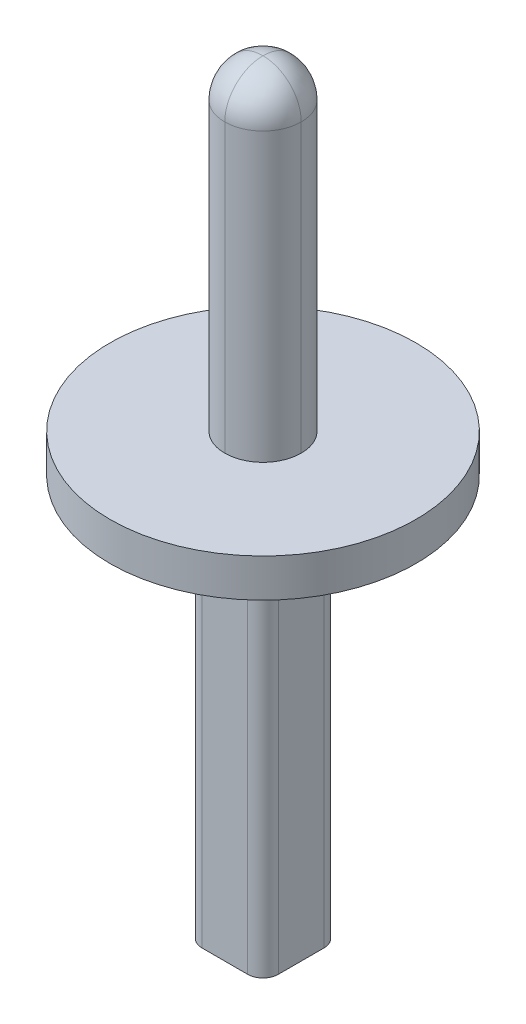
ISO-10303-21;
HEADER;
FILE_DESCRIPTION(('STEP AP214'),'2;1');
FILE_NAME('part.step','',(''),(''),'','','');
FILE_SCHEMA(('AUTOMOTIVE_DESIGN { 1 0 10303 214 1 1 1 1 }'));
ENDSEC;
DATA;
#1=APPLICATION_CONTEXT('core data for automotive mechanical design processes');
#2=APPLICATION_PROTOCOL_DEFINITION('international standard','automotive_design',2000,#1);
#3=PRODUCT_CONTEXT('',#1,'mechanical');
#4=PRODUCT('Part','Part','',(#3));
#5=PRODUCT_RELATED_PRODUCT_CATEGORY('part','',(#4));
#6=PRODUCT_DEFINITION_FORMATION('','',#4);
#7=PRODUCT_DEFINITION_CONTEXT('part definition',#1,'design');
#8=PRODUCT_DEFINITION('design','',#6,#7);
#9=PRODUCT_DEFINITION_SHAPE('','',#8);
#10=(LENGTH_UNIT() NAMED_UNIT(*) SI_UNIT(.MILLI.,.METRE.));
#11=(NAMED_UNIT(*) PLANE_ANGLE_UNIT() SI_UNIT($,.RADIAN.));
#12=(NAMED_UNIT(*) SI_UNIT($,.STERADIAN.) SOLID_ANGLE_UNIT());
#13=UNCERTAINTY_MEASURE_WITH_UNIT(LENGTH_MEASURE(1.E-05),#10,'distance_accuracy_value','');
#14=(GEOMETRIC_REPRESENTATION_CONTEXT(3) GLOBAL_UNCERTAINTY_ASSIGNED_CONTEXT((#13)) GLOBAL_UNIT_ASSIGNED_CONTEXT((#10,
#11,#12)) REPRESENTATION_CONTEXT('',''));
#15=CARTESIAN_POINT('',(0.,0.,0.));
#16=DIRECTION('',(0.,0.,1.));
#17=DIRECTION('',(1.,0.,0.));
#18=AXIS2_PLACEMENT_3D('',#15,#16,#17);
#19=CARTESIAN_POINT('',(0.,7.50000000000001,0.));
#20=DIRECTION('',(0.,1.,0.));
#21=DIRECTION('',(0.,0.,1.));
#22=AXIS2_PLACEMENT_3D('',#19,#20,#21);
#23=PLANE('',#22);
#24=CARTESIAN_POINT('',(0.,7.50000000000001,0.));
#25=DIRECTION('',(0.,1.,0.));
#26=DIRECTION('',(0.,0.,1.));
#27=AXIS2_PLACEMENT_3D('',#24,#25,#26);
#28=CIRCLE('',#27,5.);
#29=CARTESIAN_POINT('',(-5.,7.50000000000001,0.));
#30=VERTEX_POINT('',#29);
#31=CARTESIAN_POINT('',(0.,7.50000000000001,-5.));
#32=VERTEX_POINT('',#31);
#33=EDGE_CURVE('E178',#30,#32,#28,.F.);
#34=ORIENTED_EDGE('',*,*,#33,.T.);
#35=CARTESIAN_POINT('',(0.,7.50000000000001,0.));
#36=DIRECTION('',(0.,1.,0.));
#37=DIRECTION('',(0.,0.,1.));
#38=AXIS2_PLACEMENT_3D('',#35,#36,#37);
#39=CIRCLE('',#38,5.);
#40=CARTESIAN_POINT('',(5.,7.50000000000001,0.));
#41=VERTEX_POINT('',#40);
#42=EDGE_CURVE('E162',#32,#41,#39,.F.);
#43=ORIENTED_EDGE('',*,*,#42,.T.);
#44=CARTESIAN_POINT('',(0.,7.50000000000001,0.));
#45=DIRECTION('',(0.,1.,0.));
#46=DIRECTION('',(0.,0.,1.));
#47=AXIS2_PLACEMENT_3D('',#44,#45,#46);
#48=CIRCLE('',#47,5.);
#49=CARTESIAN_POINT('',(0.,7.50000000000001,5.));
#50=VERTEX_POINT('',#49);
#51=EDGE_CURVE('E174',#41,#50,#48,.F.);
#52=ORIENTED_EDGE('',*,*,#51,.T.);
#53=CARTESIAN_POINT('',(0.,7.50000000000001,0.));
#54=DIRECTION('',(0.,1.,0.));
#55=DIRECTION('',(0.,0.,1.));
#56=AXIS2_PLACEMENT_3D('',#53,#54,#55);
#57=CIRCLE('',#56,5.);
#58=EDGE_CURVE('E176',#50,#30,#57,.F.);
#59=ORIENTED_EDGE('',*,*,#58,.T.);
#60=EDGE_LOOP('',(#34,#43,#52,#59));
#61=FACE_BOUND('',#60,.T.);
#62=CARTESIAN_POINT('',(0.,7.50000000000001,0.));
#63=DIRECTION('',(0.,1.,0.));
#64=DIRECTION('',(0.,0.,1.));
#65=AXIS2_PLACEMENT_3D('',#62,#63,#64);
#66=CIRCLE('',#65,20.);
#67=CARTESIAN_POINT('',(0.,7.50000000000001,20.));
#68=VERTEX_POINT('',#67);
#69=EDGE_CURVE('E228',#68,#68,#66,.T.);
#70=ORIENTED_EDGE('',*,*,#69,.T.);
#71=EDGE_LOOP('',(#70));
#72=FACE_BOUND('',#71,.T.);
#73=ADVANCED_FACE('F41',(#61,#72),#23,.T.);
#74=CARTESIAN_POINT('',(0.,2.5,0.));
#75=DIRECTION('',(0.,1.,0.));
#76=DIRECTION('',(0.,0.,1.));
#77=AXIS2_PLACEMENT_3D('',#74,#75,#76);
#78=PLANE('',#77);
#79=CARTESIAN_POINT('',(0.,2.5,0.));
#80=DIRECTION('',(0.,1.,0.));
#81=DIRECTION('',(0.,0.,1.));
#82=AXIS2_PLACEMENT_3D('',#79,#80,#81);
#83=CIRCLE('',#82,20.);
#84=CARTESIAN_POINT('',(0.,2.5,20.));
#85=VERTEX_POINT('',#84);
#86=EDGE_CURVE('E229',#85,#85,#83,.T.);
#87=ORIENTED_EDGE('',*,*,#86,.F.);
#88=EDGE_LOOP('',(#87));
#89=FACE_BOUND('',#88,.T.);
#90=DIRECTION('',(-1.,0.,0.));
#91=VECTOR('',#90,1.);
#92=CARTESIAN_POINT('',(-5.,2.5,-5.));
#93=LINE('',#92,#91);
#94=CARTESIAN_POINT('',(3.,2.5,-5.));
#95=VERTEX_POINT('',#94);
#96=CARTESIAN_POINT('',(-3.,2.5,-5.));
#97=VERTEX_POINT('',#96);
#98=EDGE_CURVE('E232',#95,#97,#93,.T.);
#99=ORIENTED_EDGE('',*,*,#98,.T.);
#100=CARTESIAN_POINT('',(-3.,2.5,-3.));
#101=DIRECTION('',(0.,1.,0.));
#102=DIRECTION('',(0.,0.,1.));
#103=AXIS2_PLACEMENT_3D('',#100,#101,#102);
#104=CIRCLE('',#103,2.);
#105=CARTESIAN_POINT('',(-5.,2.5,-3.));
#106=VERTEX_POINT('',#105);
#107=EDGE_CURVE('E130',#97,#106,#104,.T.);
#108=ORIENTED_EDGE('',*,*,#107,.T.);
#109=DIRECTION('',(0.,0.,1.));
#110=VECTOR('',#109,1.);
#111=CARTESIAN_POINT('',(-5.,2.5,-5.));
#112=LINE('',#111,#110);
#113=CARTESIAN_POINT('',(-5.,2.5,3.));
#114=VERTEX_POINT('',#113);
#115=EDGE_CURVE('E165',#106,#114,#112,.T.);
#116=ORIENTED_EDGE('',*,*,#115,.T.);
#117=CARTESIAN_POINT('',(-3.,2.5,3.));
#118=DIRECTION('',(0.,1.,0.));
#119=DIRECTION('',(0.,0.,1.));
#120=AXIS2_PLACEMENT_3D('',#117,#118,#119);
#121=CIRCLE('',#120,2.);
#122=CARTESIAN_POINT('',(-3.,2.5,5.));
#123=VERTEX_POINT('',#122);
#124=EDGE_CURVE('E183',#114,#123,#121,.T.);
#125=ORIENTED_EDGE('',*,*,#124,.T.);
#126=DIRECTION('',(1.,0.,0.));
#127=VECTOR('',#126,1.);
#128=CARTESIAN_POINT('',(-5.,2.5,5.));
#129=LINE('',#128,#127);
#130=CARTESIAN_POINT('',(3.,2.5,5.));
#131=VERTEX_POINT('',#130);
#132=EDGE_CURVE('E239',#123,#131,#129,.T.);
#133=ORIENTED_EDGE('',*,*,#132,.T.);
#134=CARTESIAN_POINT('',(3.,2.5,3.));
#135=DIRECTION('',(0.,1.,0.));
#136=DIRECTION('',(0.,0.,1.));
#137=AXIS2_PLACEMENT_3D('',#134,#135,#136);
#138=CIRCLE('',#137,2.);
#139=CARTESIAN_POINT('',(5.,2.5,3.));
#140=VERTEX_POINT('',#139);
#141=EDGE_CURVE('E181',#131,#140,#138,.T.);
#142=ORIENTED_EDGE('',*,*,#141,.T.);
#143=DIRECTION('',(0.,0.,-1.));
#144=VECTOR('',#143,1.);
#145=CARTESIAN_POINT('',(5.,2.5,-5.));
#146=LINE('',#145,#144);
#147=CARTESIAN_POINT('',(5.,2.5,-3.));
#148=VERTEX_POINT('',#147);
#149=EDGE_CURVE('E236',#140,#148,#146,.T.);
#150=ORIENTED_EDGE('',*,*,#149,.T.);
#151=CARTESIAN_POINT('',(3.,2.5,-3.));
#152=DIRECTION('',(0.,1.,0.));
#153=DIRECTION('',(0.,0.,1.));
#154=AXIS2_PLACEMENT_3D('',#151,#152,#153);
#155=CIRCLE('',#154,2.);
#156=EDGE_CURVE('E185',#148,#95,#155,.T.);
#157=ORIENTED_EDGE('',*,*,#156,.T.);
#158=EDGE_LOOP('',(#99,#108,#116,#125,#133,#142,#150,#157));
#159=FACE_BOUND('',#158,.T.);
#160=ADVANCED_FACE('F243',(#89,#159),#78,.F.);
#161=CARTESIAN_POINT('',(0.,7.50000000000001,0.));
#162=DIRECTION('',(0.,-1.,0.));
#163=DIRECTION('',(0.,0.,-1.));
#164=AXIS2_PLACEMENT_3D('',#161,#162,#163);
#165=CYLINDRICAL_SURFACE('',#164,20.);
#166=ORIENTED_EDGE('',*,*,#69,.F.);
#167=EDGE_LOOP('',(#166));
#168=FACE_BOUND('',#167,.T.);
#169=ORIENTED_EDGE('',*,*,#86,.T.);
#170=EDGE_LOOP('',(#169));
#171=FACE_BOUND('',#170,.T.);
#172=ADVANCED_FACE('F295',(#168,#171),#165,.T.);
#173=CARTESIAN_POINT('',(0.,-50.,0.));
#174=DIRECTION('',(0.,-1.,0.));
#175=DIRECTION('',(0.,0.,-1.));
#176=AXIS2_PLACEMENT_3D('',#173,#174,#175);
#177=PLANE('',#176);
#178=DIRECTION('',(0.,0.,1.));
#179=VECTOR('',#178,1.);
#180=CARTESIAN_POINT('',(-5.,-50.,5.));
#181=LINE('',#180,#179);
#182=CARTESIAN_POINT('',(-5.,-50.,-3.));
#183=VERTEX_POINT('',#182);
#184=CARTESIAN_POINT('',(-5.,-50.,3.));
#185=VERTEX_POINT('',#184);
#186=EDGE_CURVE('E219',#183,#185,#181,.T.);
#187=ORIENTED_EDGE('',*,*,#186,.F.);
#188=CARTESIAN_POINT('',(-3.,-50.,-3.));
#189=DIRECTION('',(0.,-1.,0.));
#190=DIRECTION('',(0.,0.,-1.));
#191=AXIS2_PLACEMENT_3D('',#188,#189,#190);
#192=CIRCLE('',#191,2.);
#193=CARTESIAN_POINT('',(-3.,-50.,-5.));
#194=VERTEX_POINT('',#193);
#195=EDGE_CURVE('E203',#183,#194,#192,.T.);
#196=ORIENTED_EDGE('',*,*,#195,.T.);
#197=DIRECTION('',(-1.,0.,0.));
#198=VECTOR('',#197,1.);
#199=CARTESIAN_POINT('',(-5.,-50.,-5.));
#200=LINE('',#199,#198);
#201=CARTESIAN_POINT('',(3.,-50.,-5.));
#202=VERTEX_POINT('',#201);
#203=EDGE_CURVE('E222',#202,#194,#200,.T.);
#204=ORIENTED_EDGE('',*,*,#203,.F.);
#205=CARTESIAN_POINT('',(3.,-50.,-3.));
#206=DIRECTION('',(0.,-1.,0.));
#207=DIRECTION('',(0.,0.,-1.));
#208=AXIS2_PLACEMENT_3D('',#205,#206,#207);
#209=CIRCLE('',#208,2.);
#210=CARTESIAN_POINT('',(5.,-50.,-3.));
#211=VERTEX_POINT('',#210);
#212=EDGE_CURVE('E205',#202,#211,#209,.T.);
#213=ORIENTED_EDGE('',*,*,#212,.T.);
#214=DIRECTION('',(0.,0.,-1.));
#215=VECTOR('',#214,1.);
#216=CARTESIAN_POINT('',(5.,-50.,5.));
#217=LINE('',#216,#215);
#218=CARTESIAN_POINT('',(5.,-50.,3.));
#219=VERTEX_POINT('',#218);
#220=EDGE_CURVE('E225',#219,#211,#217,.T.);
#221=ORIENTED_EDGE('',*,*,#220,.F.);
#222=CARTESIAN_POINT('',(3.,-50.,3.));
#223=DIRECTION('',(0.,-1.,0.));
#224=DIRECTION('',(0.,0.,-1.));
#225=AXIS2_PLACEMENT_3D('',#222,#223,#224);
#226=CIRCLE('',#225,2.);
#227=CARTESIAN_POINT('',(3.,-50.,5.));
#228=VERTEX_POINT('',#227);
#229=EDGE_CURVE('E209',#219,#228,#226,.T.);
#230=ORIENTED_EDGE('',*,*,#229,.T.);
#231=DIRECTION('',(1.,0.,0.));
#232=VECTOR('',#231,1.);
#233=CARTESIAN_POINT('',(-5.,-50.,5.));
#234=LINE('',#233,#232);
#235=CARTESIAN_POINT('',(-3.,-50.,5.));
#236=VERTEX_POINT('',#235);
#237=EDGE_CURVE('E216',#236,#228,#234,.T.);
#238=ORIENTED_EDGE('',*,*,#237,.F.);
#239=CARTESIAN_POINT('',(-3.,-50.,3.));
#240=DIRECTION('',(0.,-1.,0.));
#241=DIRECTION('',(0.,0.,-1.));
#242=AXIS2_PLACEMENT_3D('',#239,#240,#241);
#243=CIRCLE('',#242,2.);
#244=EDGE_CURVE('E207',#236,#185,#243,.T.);
#245=ORIENTED_EDGE('',*,*,#244,.T.);
#246=EDGE_LOOP('',(#187,#196,#204,#213,#221,#230,#238,#245));
#247=FACE_BOUND('',#246,.T.);
#248=ADVANCED_FACE('F257',(#247),#177,.T.);
#249=CARTESIAN_POINT('',(-5.,50.,5.));
#250=DIRECTION('',(0.,0.,-1.));
#251=DIRECTION('',(-1.,0.,0.));
#252=AXIS2_PLACEMENT_3D('',#249,#250,#251);
#253=PLANE('',#252);
#254=ORIENTED_EDGE('',*,*,#132,.F.);
#255=DIRECTION('',(0.,-1.,0.));
#256=VECTOR('',#255,1.);
#257=CARTESIAN_POINT('',(-3.,50.,5.));
#258=LINE('',#257,#256);
#259=EDGE_CURVE('E188',#123,#236,#258,.T.);
#260=ORIENTED_EDGE('',*,*,#259,.T.);
#261=ORIENTED_EDGE('',*,*,#237,.T.);
#262=DIRECTION('',(0.,-1.,0.));
#263=VECTOR('',#262,1.);
#264=CARTESIAN_POINT('',(3.,50.,5.));
#265=LINE('',#264,#263);
#266=EDGE_CURVE('E191',#228,#131,#265,.F.);
#267=ORIENTED_EDGE('',*,*,#266,.T.);
#268=EDGE_LOOP('',(#254,#260,#261,#267));
#269=FACE_BOUND('',#268,.T.);
#270=ADVANCED_FACE('F253',(#269),#253,.F.);
#271=CARTESIAN_POINT('',(-5.,50.,5.));
#272=DIRECTION('',(1.,0.,0.));
#273=DIRECTION('',(0.,0.,-1.));
#274=AXIS2_PLACEMENT_3D('',#271,#272,#273);
#275=PLANE('',#274);
#276=ORIENTED_EDGE('',*,*,#115,.F.);
#277=DIRECTION('',(0.,-1.,0.));
#278=VECTOR('',#277,1.);
#279=CARTESIAN_POINT('',(-5.,50.,-3.));
#280=LINE('',#279,#278);
#281=EDGE_CURVE('E211',#106,#183,#280,.T.);
#282=ORIENTED_EDGE('',*,*,#281,.T.);
#283=ORIENTED_EDGE('',*,*,#186,.T.);
#284=DIRECTION('',(0.,-1.,0.));
#285=VECTOR('',#284,1.);
#286=CARTESIAN_POINT('',(-5.,50.,3.));
#287=LINE('',#286,#285);
#288=EDGE_CURVE('E214',#185,#114,#287,.F.);
#289=ORIENTED_EDGE('',*,*,#288,.T.);
#290=EDGE_LOOP('',(#276,#282,#283,#289));
#291=FACE_BOUND('',#290,.T.);
#292=ADVANCED_FACE('F278',(#291),#275,.F.);
#293=CARTESIAN_POINT('',(-5.,50.,-5.));
#294=DIRECTION('',(0.,0.,1.));
#295=DIRECTION('',(1.,0.,0.));
#296=AXIS2_PLACEMENT_3D('',#293,#294,#295);
#297=PLANE('',#296);
#298=ORIENTED_EDGE('',*,*,#203,.T.);
#299=DIRECTION('',(0.,-1.,0.));
#300=VECTOR('',#299,1.);
#301=CARTESIAN_POINT('',(-3.,50.,-5.));
#302=LINE('',#301,#300);
#303=EDGE_CURVE('E198',#194,#97,#302,.F.);
#304=ORIENTED_EDGE('',*,*,#303,.T.);
#305=ORIENTED_EDGE('',*,*,#98,.F.);
#306=DIRECTION('',(0.,-1.,0.));
#307=VECTOR('',#306,1.);
#308=CARTESIAN_POINT('',(3.,50.,-5.));
#309=LINE('',#308,#307);
#310=EDGE_CURVE('E200',#95,#202,#309,.T.);
#311=ORIENTED_EDGE('',*,*,#310,.T.);
#312=EDGE_LOOP('',(#298,#304,#305,#311));
#313=FACE_BOUND('',#312,.T.);
#314=ADVANCED_FACE('F274',(#313),#297,.F.);
#315=CARTESIAN_POINT('',(5.,50.,5.));
#316=DIRECTION('',(-1.,0.,0.));
#317=DIRECTION('',(0.,0.,1.));
#318=AXIS2_PLACEMENT_3D('',#315,#316,#317);
#319=PLANE('',#318);
#320=ORIENTED_EDGE('',*,*,#220,.T.);
#321=DIRECTION('',(0.,-1.,0.));
#322=VECTOR('',#321,1.);
#323=CARTESIAN_POINT('',(5.,50.,-3.));
#324=LINE('',#323,#322);
#325=EDGE_CURVE('E193',#211,#148,#324,.F.);
#326=ORIENTED_EDGE('',*,*,#325,.T.);
#327=ORIENTED_EDGE('',*,*,#149,.F.);
#328=DIRECTION('',(0.,-1.,0.));
#329=VECTOR('',#328,1.);
#330=CARTESIAN_POINT('',(5.,50.,3.));
#331=LINE('',#330,#329);
#332=EDGE_CURVE('E195',#140,#219,#331,.T.);
#333=ORIENTED_EDGE('',*,*,#332,.T.);
#334=EDGE_LOOP('',(#320,#326,#327,#333));
#335=FACE_BOUND('',#334,.T.);
#336=ADVANCED_FACE('F265',(#335),#319,.F.);
#337=CARTESIAN_POINT('',(-3.,50.,-3.));
#338=DIRECTION('',(0.,-1.,0.));
#339=DIRECTION('',(0.,0.,-1.));
#340=AXIS2_PLACEMENT_3D('',#337,#338,#339);
#341=CYLINDRICAL_SURFACE('',#340,2.);
#342=ORIENTED_EDGE('',*,*,#107,.F.);
#343=ORIENTED_EDGE('',*,*,#303,.F.);
#344=ORIENTED_EDGE('',*,*,#195,.F.);
#345=ORIENTED_EDGE('',*,*,#281,.F.);
#346=EDGE_LOOP('',(#342,#343,#344,#345));
#347=FACE_BOUND('',#346,.T.);
#348=ADVANCED_FACE('F277',(#347),#341,.T.);
#349=CARTESIAN_POINT('',(3.,50.,-3.));
#350=DIRECTION('',(0.,-1.,0.));
#351=DIRECTION('',(0.,0.,-1.));
#352=AXIS2_PLACEMENT_3D('',#349,#350,#351);
#353=CYLINDRICAL_SURFACE('',#352,2.);
#354=ORIENTED_EDGE('',*,*,#156,.F.);
#355=ORIENTED_EDGE('',*,*,#325,.F.);
#356=ORIENTED_EDGE('',*,*,#212,.F.);
#357=ORIENTED_EDGE('',*,*,#310,.F.);
#358=EDGE_LOOP('',(#354,#355,#356,#357));
#359=FACE_BOUND('',#358,.T.);
#360=ADVANCED_FACE('F271',(#359),#353,.T.);
#361=CARTESIAN_POINT('',(-3.,50.,3.));
#362=DIRECTION('',(0.,-1.,0.));
#363=DIRECTION('',(0.,0.,-1.));
#364=AXIS2_PLACEMENT_3D('',#361,#362,#363);
#365=CYLINDRICAL_SURFACE('',#364,2.);
#366=ORIENTED_EDGE('',*,*,#124,.F.);
#367=ORIENTED_EDGE('',*,*,#288,.F.);
#368=ORIENTED_EDGE('',*,*,#244,.F.);
#369=ORIENTED_EDGE('',*,*,#259,.F.);
#370=EDGE_LOOP('',(#366,#367,#368,#369));
#371=FACE_BOUND('',#370,.T.);
#372=ADVANCED_FACE('F250',(#371),#365,.T.);
#373=CARTESIAN_POINT('',(3.,50.,3.));
#374=DIRECTION('',(0.,-1.,0.));
#375=DIRECTION('',(0.,0.,-1.));
#376=AXIS2_PLACEMENT_3D('',#373,#374,#375);
#377=CYLINDRICAL_SURFACE('',#376,2.);
#378=ORIENTED_EDGE('',*,*,#141,.F.);
#379=ORIENTED_EDGE('',*,*,#266,.F.);
#380=ORIENTED_EDGE('',*,*,#229,.F.);
#381=ORIENTED_EDGE('',*,*,#332,.F.);
#382=EDGE_LOOP('',(#378,#379,#380,#381));
#383=FACE_BOUND('',#382,.T.);
#384=ADVANCED_FACE('F262',(#383),#377,.T.);
#385=CARTESIAN_POINT('',(0.,50.,0.));
#386=DIRECTION('',(0.,-1.,0.));
#387=DIRECTION('',(0.,0.,-1.));
#388=AXIS2_PLACEMENT_3D('',#385,#386,#387);
#389=CYLINDRICAL_SURFACE('',#388,5.);
#390=DIRECTION('',(0.,-1.,0.));
#391=VECTOR('',#390,1.);
#392=CARTESIAN_POINT('',(5.,50.,0.));
#393=LINE('',#392,#391);
#394=CARTESIAN_POINT('',(5.,45.,0.));
#395=VERTEX_POINT('',#394);
#396=EDGE_CURVE('E163',#395,#41,#393,.T.);
#397=ORIENTED_EDGE('',*,*,#396,.F.);
#398=CARTESIAN_POINT('',(0.,45.,0.));
#399=DIRECTION('',(0.,-1.,0.));
#400=DIRECTION('',(0.,0.,-1.));
#401=AXIS2_PLACEMENT_3D('',#398,#399,#400);
#402=CIRCLE('',#401,5.);
#403=CARTESIAN_POINT('',(0.,45.,5.));
#404=VERTEX_POINT('',#403);
#405=EDGE_CURVE('E156',#395,#404,#402,.T.);
#406=ORIENTED_EDGE('',*,*,#405,.T.);
#407=DIRECTION('',(0.,-1.,0.));
#408=VECTOR('',#407,1.);
#409=CARTESIAN_POINT('',(0.,50.,5.));
#410=LINE('',#409,#408);
#411=EDGE_CURVE('E166',#50,#404,#410,.F.);
#412=ORIENTED_EDGE('',*,*,#411,.F.);
#413=ORIENTED_EDGE('',*,*,#51,.F.);
#414=EDGE_LOOP('',(#397,#406,#412,#413));
#415=FACE_BOUND('',#414,.T.);
#416=ADVANCED_FACE('F374',(#415),#389,.T.);
#417=CARTESIAN_POINT('',(0.,50.,0.));
#418=DIRECTION('',(0.,-1.,0.));
#419=DIRECTION('',(0.,0.,-1.));
#420=AXIS2_PLACEMENT_3D('',#417,#418,#419);
#421=CYLINDRICAL_SURFACE('',#420,5.);
#422=DIRECTION('',(0.,-1.,0.));
#423=VECTOR('',#422,1.);
#424=CARTESIAN_POINT('',(0.,50.,-5.));
#425=LINE('',#424,#423);
#426=CARTESIAN_POINT('',(0.,45.,-5.));
#427=VERTEX_POINT('',#426);
#428=EDGE_CURVE('E169',#427,#32,#425,.T.);
#429=ORIENTED_EDGE('',*,*,#428,.F.);
#430=CARTESIAN_POINT('',(0.,45.,0.));
#431=DIRECTION('',(0.,-1.,0.));
#432=DIRECTION('',(0.,0.,-1.));
#433=AXIS2_PLACEMENT_3D('',#430,#431,#432);
#434=CIRCLE('',#433,5.);
#435=EDGE_CURVE('E11',#427,#395,#434,.T.);
#436=ORIENTED_EDGE('',*,*,#435,.T.);
#437=ORIENTED_EDGE('',*,*,#396,.T.);
#438=ORIENTED_EDGE('',*,*,#42,.F.);
#439=EDGE_LOOP('',(#429,#436,#437,#438));
#440=FACE_BOUND('',#439,.T.);
#441=ADVANCED_FACE('F381',(#440),#421,.T.);
#442=CARTESIAN_POINT('',(0.,50.,0.));
#443=DIRECTION('',(0.,-1.,0.));
#444=DIRECTION('',(0.,0.,-1.));
#445=AXIS2_PLACEMENT_3D('',#442,#443,#444);
#446=CYLINDRICAL_SURFACE('',#445,5.);
#447=ORIENTED_EDGE('',*,*,#411,.T.);
#448=CARTESIAN_POINT('',(0.,45.,0.));
#449=DIRECTION('',(0.,-1.,0.));
#450=DIRECTION('',(0.,0.,-1.));
#451=AXIS2_PLACEMENT_3D('',#448,#449,#450);
#452=CIRCLE('',#451,5.);
#453=CARTESIAN_POINT('',(-5.,45.,0.));
#454=VERTEX_POINT('',#453);
#455=EDGE_CURVE('E150',#404,#454,#452,.T.);
#456=ORIENTED_EDGE('',*,*,#455,.T.);
#457=DIRECTION('',(0.,-1.,0.));
#458=VECTOR('',#457,1.);
#459=CARTESIAN_POINT('',(-5.,50.,0.));
#460=LINE('',#459,#458);
#461=EDGE_CURVE('E142',#30,#454,#460,.F.);
#462=ORIENTED_EDGE('',*,*,#461,.F.);
#463=ORIENTED_EDGE('',*,*,#58,.F.);
#464=EDGE_LOOP('',(#447,#456,#462,#463));
#465=FACE_BOUND('',#464,.T.);
#466=ADVANCED_FACE('F390',(#465),#446,.T.);
#467=CARTESIAN_POINT('',(0.,50.,0.));
#468=DIRECTION('',(0.,-1.,0.));
#469=DIRECTION('',(0.,0.,-1.));
#470=AXIS2_PLACEMENT_3D('',#467,#468,#469);
#471=CYLINDRICAL_SURFACE('',#470,5.);
#472=ORIENTED_EDGE('',*,*,#461,.T.);
#473=CARTESIAN_POINT('',(0.,45.,0.));
#474=DIRECTION('',(0.,-1.,0.));
#475=DIRECTION('',(0.,0.,-1.));
#476=AXIS2_PLACEMENT_3D('',#473,#474,#475);
#477=CIRCLE('',#476,5.);
#478=EDGE_CURVE('E51',#454,#427,#477,.T.);
#479=ORIENTED_EDGE('',*,*,#478,.T.);
#480=ORIENTED_EDGE('',*,*,#428,.T.);
#481=ORIENTED_EDGE('',*,*,#33,.F.);
#482=EDGE_LOOP('',(#472,#479,#480,#481));
#483=FACE_BOUND('',#482,.T.);
#484=ADVANCED_FACE('F399',(#483),#471,.T.);
#485=CARTESIAN_POINT('',(0.,45.,0.));
#486=DIRECTION('',(0.,-1.,0.));
#487=DIRECTION('',(0.,0.,-1.));
#488=AXIS2_PLACEMENT_3D('',#485,#486,#487);
#489=SPHERICAL_SURFACE('',#488,5.);
#490=CARTESIAN_POINT('',(0.,45.,0.));
#491=DIRECTION('',(1.,0.,0.));
#492=DIRECTION('',(0.,0.,-1.));
#493=AXIS2_PLACEMENT_3D('',#490,#491,#492);
#494=CIRCLE('',#493,5.);
#495=CARTESIAN_POINT('',(0.,50.,0.));
#496=VERTEX_POINT('',#495);
#497=EDGE_CURVE('E137',#427,#496,#494,.T.);
#498=ORIENTED_EDGE('',*,*,#497,.F.);
#499=ORIENTED_EDGE('',*,*,#478,.F.);
#500=CARTESIAN_POINT('',(0.,45.,0.));
#501=DIRECTION('',(0.,0.,1.));
#502=DIRECTION('',(1.,0.,0.));
#503=AXIS2_PLACEMENT_3D('',#500,#501,#502);
#504=CIRCLE('',#503,5.);
#505=EDGE_CURVE('E45',#496,#454,#504,.T.);
#506=ORIENTED_EDGE('',*,*,#505,.F.);
#507=EDGE_LOOP('',(#498,#499,#506));
#508=FACE_BOUND('',#507,.T.);
#509=ADVANCED_FACE('F43',(#508),#489,.T.);
#510=CARTESIAN_POINT('',(0.,45.,0.));
#511=DIRECTION('',(0.,-1.,0.));
#512=DIRECTION('',(0.,0.,-1.));
#513=AXIS2_PLACEMENT_3D('',#510,#511,#512);
#514=SPHERICAL_SURFACE('',#513,5.);
#515=ORIENTED_EDGE('',*,*,#505,.T.);
#516=ORIENTED_EDGE('',*,*,#455,.F.);
#517=CARTESIAN_POINT('',(0.,45.,0.));
#518=DIRECTION('',(1.,0.,0.));
#519=DIRECTION('',(0.,0.,-1.));
#520=AXIS2_PLACEMENT_3D('',#517,#518,#519);
#521=CIRCLE('',#520,5.);
#522=EDGE_CURVE('E148',#496,#404,#521,.T.);
#523=ORIENTED_EDGE('',*,*,#522,.F.);
#524=EDGE_LOOP('',(#515,#516,#523));
#525=FACE_BOUND('',#524,.T.);
#526=ADVANCED_FACE('F149',(#525),#514,.T.);
#527=CARTESIAN_POINT('',(0.,45.,0.));
#528=DIRECTION('',(0.,-1.,0.));
#529=DIRECTION('',(0.,0.,-1.));
#530=AXIS2_PLACEMENT_3D('',#527,#528,#529);
#531=SPHERICAL_SURFACE('',#530,5.);
#532=ORIENTED_EDGE('',*,*,#435,.F.);
#533=ORIENTED_EDGE('',*,*,#497,.T.);
#534=CARTESIAN_POINT('',(0.,45.,0.));
#535=DIRECTION('',(0.,0.,1.));
#536=DIRECTION('',(1.,0.,0.));
#537=AXIS2_PLACEMENT_3D('',#534,#535,#536);
#538=CIRCLE('',#537,5.);
#539=EDGE_CURVE('E147',#395,#496,#538,.T.);
#540=ORIENTED_EDGE('',*,*,#539,.F.);
#541=EDGE_LOOP('',(#532,#533,#540));
#542=FACE_BOUND('',#541,.T.);
#543=ADVANCED_FACE('F145',(#542),#531,.T.);
#544=CARTESIAN_POINT('',(0.,45.,0.));
#545=DIRECTION('',(0.,-1.,0.));
#546=DIRECTION('',(0.,0.,-1.));
#547=AXIS2_PLACEMENT_3D('',#544,#545,#546);
#548=SPHERICAL_SURFACE('',#547,5.);
#549=ORIENTED_EDGE('',*,*,#522,.T.);
#550=ORIENTED_EDGE('',*,*,#405,.F.);
#551=ORIENTED_EDGE('',*,*,#539,.T.);
#552=EDGE_LOOP('',(#549,#550,#551));
#553=FACE_BOUND('',#552,.T.);
#554=ADVANCED_FACE('F155',(#553),#548,.T.);
#555=CLOSED_SHELL('',(#73,#160,#172,#248,#270,#292,#314,#336,#348,#360,#372,#384,#416,#441,#466,
#484,#509,#526,#543,#554));
#556=MANIFOLD_SOLID_BREP('B2',#555);
#557=ADVANCED_BREP_SHAPE_REPRESENTATION('',(#18,#556),#14);
#558=SHAPE_DEFINITION_REPRESENTATION(#9,#557);
ENDSEC;
END-ISO-10303-21;
